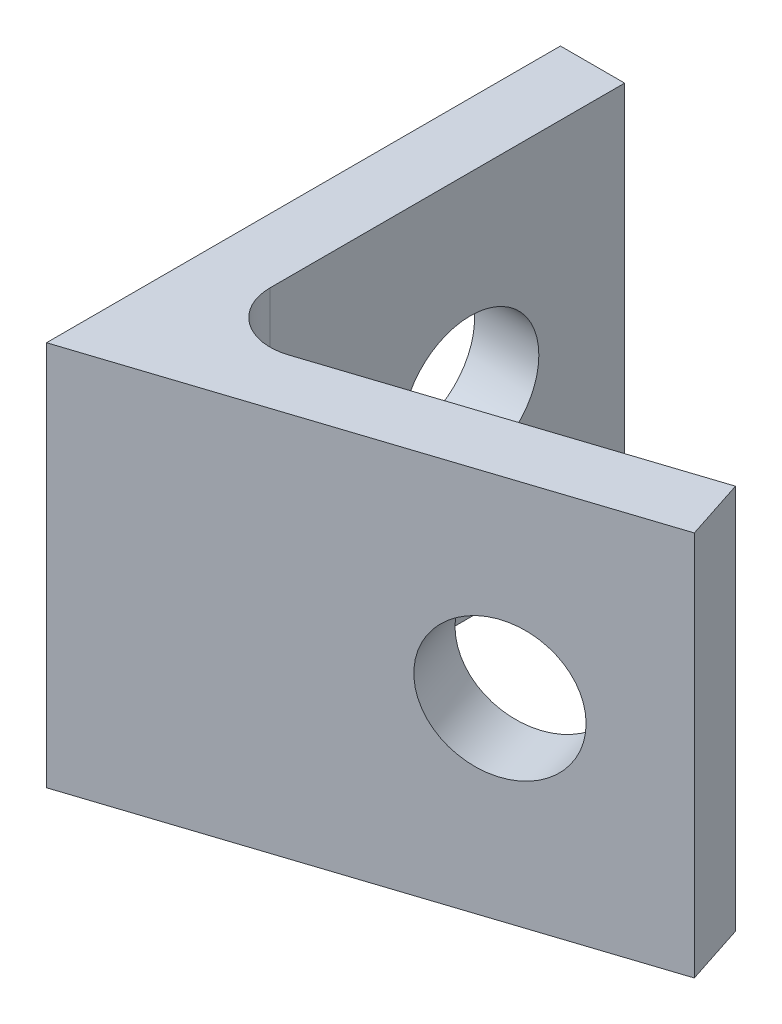
ISO-10303-21;
HEADER;
FILE_DESCRIPTION(('STEP AP214'),'2;1');
FILE_NAME('part.step','',(''),(''),'','','');
FILE_SCHEMA(('AUTOMOTIVE_DESIGN { 1 0 10303 214 1 1 1 1 }'));
ENDSEC;
DATA;
#1=APPLICATION_CONTEXT('core data for automotive mechanical design processes');
#2=APPLICATION_PROTOCOL_DEFINITION('international standard','automotive_design',2000,#1);
#3=PRODUCT_CONTEXT('',#1,'mechanical');
#4=PRODUCT('Part','Part','',(#3));
#5=PRODUCT_RELATED_PRODUCT_CATEGORY('part','',(#4));
#6=PRODUCT_DEFINITION_FORMATION('','',#4);
#7=PRODUCT_DEFINITION_CONTEXT('part definition',#1,'design');
#8=PRODUCT_DEFINITION('design','',#6,#7);
#9=PRODUCT_DEFINITION_SHAPE('','',#8);
#10=(LENGTH_UNIT() NAMED_UNIT(*) SI_UNIT(.MILLI.,.METRE.));
#11=(NAMED_UNIT(*) PLANE_ANGLE_UNIT() SI_UNIT($,.RADIAN.));
#12=(NAMED_UNIT(*) SI_UNIT($,.STERADIAN.) SOLID_ANGLE_UNIT());
#13=UNCERTAINTY_MEASURE_WITH_UNIT(LENGTH_MEASURE(1.E-05),#10,'distance_accuracy_value','');
#14=(GEOMETRIC_REPRESENTATION_CONTEXT(3) GLOBAL_UNCERTAINTY_ASSIGNED_CONTEXT((#13)) GLOBAL_UNIT_ASSIGNED_CONTEXT((#10,
#11,#12)) REPRESENTATION_CONTEXT('',''));
#15=CARTESIAN_POINT('',(0.,0.,0.));
#16=DIRECTION('',(0.,0.,1.));
#17=DIRECTION('',(1.,0.,0.));
#18=AXIS2_PLACEMENT_3D('',#15,#16,#17);
#19=CARTESIAN_POINT('',(3.175,19.05,-25.4));
#20=DIRECTION('',(1.,0.,0.));
#21=DIRECTION('',(0.,0.,-1.));
#22=AXIS2_PLACEMENT_3D('',#19,#20,#21);
#23=PLANE('',#22);
#24=CARTESIAN_POINT('',(3.175,9.525,-17.78));
#25=DIRECTION('',(1.,0.,0.));
#26=DIRECTION('',(0.,0.,-1.));
#27=AXIS2_PLACEMENT_3D('',#24,#25,#26);
#28=CIRCLE('',#27,3.3782);
#29=CARTESIAN_POINT('',(3.175,9.525,-21.1582));
#30=VERTEX_POINT('',#29);
#31=EDGE_CURVE('E143',#30,#30,#28,.T.);
#32=ORIENTED_EDGE('',*,*,#31,.F.);
#33=EDGE_LOOP('',(#32));
#34=FACE_BOUND('',#33,.T.);
#35=DIRECTION('',(0.,0.,1.));
#36=VECTOR('',#35,1.);
#37=CARTESIAN_POINT('',(3.175,19.05,-25.4));
#38=LINE('',#37,#36);
#39=CARTESIAN_POINT('',(3.175,19.05,-25.4));
#40=VERTEX_POINT('',#39);
#41=CARTESIAN_POINT('',(3.175,19.05,-7.87201998770114));
#42=VERTEX_POINT('',#41);
#43=EDGE_CURVE('E109',#40,#42,#38,.T.);
#44=ORIENTED_EDGE('',*,*,#43,.T.);
#45=DIRECTION('',(0.,-1.,0.));
#46=VECTOR('',#45,1.);
#47=CARTESIAN_POINT('',(3.175,0.,-7.87201998770114));
#48=LINE('',#47,#46);
#49=CARTESIAN_POINT('',(3.175,0.,-7.87201998770114));
#50=VERTEX_POINT('',#49);
#51=EDGE_CURVE('E163',#42,#50,#48,.T.);
#52=ORIENTED_EDGE('',*,*,#51,.T.);
#53=DIRECTION('',(0.,0.,1.));
#54=VECTOR('',#53,1.);
#55=CARTESIAN_POINT('',(3.175,0.,-25.4));
#56=LINE('',#55,#54);
#57=CARTESIAN_POINT('',(3.175,0.,-25.4));
#58=VERTEX_POINT('',#57);
#59=EDGE_CURVE('E139',#58,#50,#56,.T.);
#60=ORIENTED_EDGE('',*,*,#59,.F.);
#61=DIRECTION('',(0.,-1.,0.));
#62=VECTOR('',#61,1.);
#63=CARTESIAN_POINT('',(3.175,19.05,-25.4));
#64=LINE('',#63,#62);
#65=EDGE_CURVE('E160',#40,#58,#64,.T.);
#66=ORIENTED_EDGE('',*,*,#65,.F.);
#67=EDGE_LOOP('',(#44,#52,#60,#66));
#68=FACE_BOUND('',#67,.T.);
#69=ADVANCED_FACE('F43',(#34,#68),#23,.T.);
#70=CARTESIAN_POINT('',(0.,19.05,-25.4));
#71=DIRECTION('',(0.,0.,-1.));
#72=DIRECTION('',(-1.,0.,0.));
#73=AXIS2_PLACEMENT_3D('',#70,#71,#72);
#74=PLANE('',#73);
#75=DIRECTION('',(1.,0.,0.));
#76=VECTOR('',#75,1.);
#77=CARTESIAN_POINT('',(0.,0.,-25.4));
#78=LINE('',#77,#76);
#79=CARTESIAN_POINT('',(0.,0.,-25.4));
#80=VERTEX_POINT('',#79);
#81=EDGE_CURVE('E156',#80,#58,#78,.T.);
#82=ORIENTED_EDGE('',*,*,#81,.F.);
#83=DIRECTION('',(0.,-1.,0.));
#84=VECTOR('',#83,1.);
#85=CARTESIAN_POINT('',(0.,19.05,-25.4));
#86=LINE('',#85,#84);
#87=CARTESIAN_POINT('',(0.,19.05,-25.4));
#88=VERTEX_POINT('',#87);
#89=EDGE_CURVE('E164',#88,#80,#86,.T.);
#90=ORIENTED_EDGE('',*,*,#89,.F.);
#91=DIRECTION('',(1.,0.,0.));
#92=VECTOR('',#91,1.);
#93=CARTESIAN_POINT('',(0.,19.05,-25.4));
#94=LINE('',#93,#92);
#95=EDGE_CURVE('E118',#88,#40,#94,.T.);
#96=ORIENTED_EDGE('',*,*,#95,.T.);
#97=ORIENTED_EDGE('',*,*,#65,.T.);
#98=EDGE_LOOP('',(#82,#90,#96,#97));
#99=FACE_BOUND('',#98,.T.);
#100=ADVANCED_FACE('F186',(#99),#74,.T.);
#101=CARTESIAN_POINT('',(0.,19.05,0.));
#102=DIRECTION('',(-1.,0.,0.));
#103=DIRECTION('',(0.,0.,1.));
#104=AXIS2_PLACEMENT_3D('',#101,#102,#103);
#105=PLANE('',#104);
#106=CARTESIAN_POINT('',(0.,9.525,-17.78));
#107=DIRECTION('',(-1.,0.,0.));
#108=DIRECTION('',(0.,0.,1.));
#109=AXIS2_PLACEMENT_3D('',#106,#107,#108);
#110=CIRCLE('',#109,3.3782);
#111=CARTESIAN_POINT('',(0.,9.525,-14.4018));
#112=VERTEX_POINT('',#111);
#113=EDGE_CURVE('E193',#112,#112,#110,.T.);
#114=ORIENTED_EDGE('',*,*,#113,.F.);
#115=EDGE_LOOP('',(#114));
#116=FACE_BOUND('',#115,.T.);
#117=DIRECTION('',(0.,0.,-1.));
#118=VECTOR('',#117,1.);
#119=CARTESIAN_POINT('',(0.,0.,0.));
#120=LINE('',#119,#118);
#121=CARTESIAN_POINT('',(0.,0.,0.));
#122=VERTEX_POINT('',#121);
#123=EDGE_CURVE('E152',#122,#80,#120,.T.);
#124=ORIENTED_EDGE('',*,*,#123,.F.);
#125=DIRECTION('',(0.,-1.,0.));
#126=VECTOR('',#125,1.);
#127=CARTESIAN_POINT('',(0.,19.05,0.));
#128=LINE('',#127,#126);
#129=CARTESIAN_POINT('',(0.,19.05,0.));
#130=VERTEX_POINT('',#129);
#131=EDGE_CURVE('E167',#130,#122,#128,.T.);
#132=ORIENTED_EDGE('',*,*,#131,.F.);
#133=DIRECTION('',(0.,0.,-1.));
#134=VECTOR('',#133,1.);
#135=CARTESIAN_POINT('',(0.,19.05,0.));
#136=LINE('',#135,#134);
#137=EDGE_CURVE('E129',#130,#88,#136,.T.);
#138=ORIENTED_EDGE('',*,*,#137,.T.);
#139=ORIENTED_EDGE('',*,*,#89,.T.);
#140=EDGE_LOOP('',(#124,#132,#138,#139));
#141=FACE_BOUND('',#140,.T.);
#142=ADVANCED_FACE('F212',(#116,#141),#105,.T.);
#143=CARTESIAN_POINT('',(24.1511405465603,19.05,-7.86653737678082));
#144=DIRECTION('',(0.309706195936253,0.,0.95083230498269));
#145=DIRECTION('',(0.95083230498269,0.,-0.309706195936253));
#146=AXIS2_PLACEMENT_3D('',#143,#144,#145);
#147=PLANE('',#146);
#148=CARTESIAN_POINT('',(16.9057983825922,9.525,-5.50657616374657));
#149=DIRECTION('',(0.309706195936253,0.,0.95083230498269));
#150=DIRECTION('',(0.95083230498269,0.,-0.309706195936253));
#151=AXIS2_PLACEMENT_3D('',#148,#149,#150);
#152=CIRCLE('',#151,3.37819999999999);
#153=CARTESIAN_POINT('',(20.1179000752847,9.525,-6.55282563485841));
#154=VERTEX_POINT('',#153);
#155=EDGE_CURVE('E201',#154,#154,#152,.T.);
#156=ORIENTED_EDGE('',*,*,#155,.F.);
#157=EDGE_LOOP('',(#156));
#158=FACE_BOUND('',#157,.T.);
#159=DIRECTION('',(-0.95083230498269,0.,0.309706195936253));
#160=VECTOR('',#159,1.);
#161=CARTESIAN_POINT('',(24.1511405465603,0.,-7.86653737678082));
#162=LINE('',#161,#160);
#163=CARTESIAN_POINT('',(24.1511405465603,0.,-7.86653737678082));
#164=VERTEX_POINT('',#163);
#165=EDGE_CURVE('E148',#164,#122,#162,.T.);
#166=ORIENTED_EDGE('',*,*,#165,.F.);
#167=DIRECTION('',(0.,-1.,0.));
#168=VECTOR('',#167,1.);
#169=CARTESIAN_POINT('',(24.1511405465603,19.05,-7.86653737678082));
#170=LINE('',#169,#168);
#171=CARTESIAN_POINT('',(24.1511405465603,19.05,-7.86653737678082));
#172=VERTEX_POINT('',#171);
#173=EDGE_CURVE('E117',#172,#164,#170,.T.);
#174=ORIENTED_EDGE('',*,*,#173,.F.);
#175=DIRECTION('',(-0.95083230498269,0.,0.309706195936253));
#176=VECTOR('',#175,1.);
#177=CARTESIAN_POINT('',(24.1511405465603,19.05,-7.86653737678082));
#178=LINE('',#177,#176);
#179=EDGE_CURVE('E125',#172,#130,#178,.T.);
#180=ORIENTED_EDGE('',*,*,#179,.T.);
#181=ORIENTED_EDGE('',*,*,#131,.T.);
#182=EDGE_LOOP('',(#166,#174,#180,#181));
#183=FACE_BOUND('',#182,.T.);
#184=ADVANCED_FACE('F209',(#158,#183),#147,.T.);
#185=CARTESIAN_POINT('',(23.1678233744627,19.05,-10.8854299451009));
#186=DIRECTION('',(0.95083230498269,0.,-0.309706195936253));
#187=DIRECTION('',(-0.309706195936253,0.,-0.95083230498269));
#188=AXIS2_PLACEMENT_3D('',#185,#186,#187);
#189=PLANE('',#188);
#190=DIRECTION('',(0.309706195936253,0.,0.95083230498269));
#191=VECTOR('',#190,1.);
#192=CARTESIAN_POINT('',(23.1678233744627,0.,-10.8854299451009));
#193=LINE('',#192,#191);
#194=CARTESIAN_POINT('',(23.1678233744627,0.,-10.8854299451009));
#195=VERTEX_POINT('',#194);
#196=EDGE_CURVE('E115',#195,#164,#193,.T.);
#197=ORIENTED_EDGE('',*,*,#196,.F.);
#198=DIRECTION('',(0.,-1.,0.));
#199=VECTOR('',#198,1.);
#200=CARTESIAN_POINT('',(23.1678233744627,19.05,-10.8854299451009));
#201=LINE('',#200,#199);
#202=CARTESIAN_POINT('',(23.1678233744627,19.05,-10.8854299451009));
#203=VERTEX_POINT('',#202);
#204=EDGE_CURVE('E102',#203,#195,#201,.T.);
#205=ORIENTED_EDGE('',*,*,#204,.F.);
#206=DIRECTION('',(0.309706195936253,0.,0.95083230498269));
#207=VECTOR('',#206,1.);
#208=CARTESIAN_POINT('',(23.1678233744627,19.05,-10.8854299451009));
#209=LINE('',#208,#207);
#210=EDGE_CURVE('E108',#203,#172,#209,.T.);
#211=ORIENTED_EDGE('',*,*,#210,.T.);
#212=ORIENTED_EDGE('',*,*,#173,.T.);
#213=EDGE_LOOP('',(#197,#205,#211,#212));
#214=FACE_BOUND('',#213,.T.);
#215=ADVANCED_FACE('F113',(#214),#189,.T.);
#216=CARTESIAN_POINT('',(3.175,19.05,-4.37334443761175));
#217=DIRECTION('',(-0.309706195936253,0.,-0.95083230498269));
#218=DIRECTION('',(-0.95083230498269,0.,0.309706195936253));
#219=AXIS2_PLACEMENT_3D('',#216,#217,#218);
#220=PLANE('',#219);
#221=CARTESIAN_POINT('',(15.9224812104946,9.525,-8.52546873206661));
#222=DIRECTION('',(-0.309706195936253,0.,-0.95083230498269));
#223=DIRECTION('',(-0.95083230498269,0.,0.309706195936253));
#224=AXIS2_PLACEMENT_3D('',#221,#222,#223);
#225=CIRCLE('',#224,3.37819999999999);
#226=CARTESIAN_POINT('',(12.7103795178021,9.525,-7.47921926095477));
#227=VERTEX_POINT('',#226);
#228=EDGE_CURVE('E197',#227,#227,#225,.T.);
#229=ORIENTED_EDGE('',*,*,#228,.F.);
#230=EDGE_LOOP('',(#229));
#231=FACE_BOUND('',#230,.T.);
#232=DIRECTION('',(0.95083230498269,0.,-0.309706195936253));
#233=VECTOR('',#232,1.);
#234=CARTESIAN_POINT('',(3.175,0.,-4.37334443761175));
#235=LINE('',#234,#233);
#236=CARTESIAN_POINT('',(6.50165373767808,0.,-5.45690593304511));
#237=VERTEX_POINT('',#236);
#238=EDGE_CURVE('E142',#237,#195,#235,.T.);
#239=ORIENTED_EDGE('',*,*,#238,.F.);
#240=DIRECTION('',(0.,-1.,0.));
#241=VECTOR('',#240,1.);
#242=CARTESIAN_POINT('',(6.50165373767808,19.05,-5.45690593304511));
#243=LINE('',#242,#241);
#244=CARTESIAN_POINT('',(6.50165373767808,19.05,-5.45690593304511));
#245=VERTEX_POINT('',#244);
#246=EDGE_CURVE('E59',#237,#245,#243,.F.);
#247=ORIENTED_EDGE('',*,*,#246,.T.);
#248=DIRECTION('',(0.95083230498269,0.,-0.309706195936253));
#249=VECTOR('',#248,1.);
#250=CARTESIAN_POINT('',(3.175,19.05,-4.37334443761175));
#251=LINE('',#250,#249);
#252=EDGE_CURVE('E99',#245,#203,#251,.T.);
#253=ORIENTED_EDGE('',*,*,#252,.T.);
#254=ORIENTED_EDGE('',*,*,#204,.T.);
#255=EDGE_LOOP('',(#239,#247,#253,#254));
#256=FACE_BOUND('',#255,.T.);
#257=ADVANCED_FACE('F101',(#231,#256),#220,.T.);
#258=CARTESIAN_POINT('',(0.,19.05,0.));
#259=DIRECTION('',(0.,1.,0.));
#260=DIRECTION('',(0.,0.,1.));
#261=AXIS2_PLACEMENT_3D('',#258,#259,#260);
#262=PLANE('',#261);
#263=ORIENTED_EDGE('',*,*,#43,.F.);
#264=ORIENTED_EDGE('',*,*,#95,.F.);
#265=ORIENTED_EDGE('',*,*,#137,.F.);
#266=ORIENTED_EDGE('',*,*,#179,.F.);
#267=ORIENTED_EDGE('',*,*,#210,.F.);
#268=ORIENTED_EDGE('',*,*,#252,.F.);
#269=CARTESIAN_POINT('',(5.715,19.05,-7.87201998770114));
#270=DIRECTION('',(0.,1.,0.));
#271=DIRECTION('',(0.,0.,1.));
#272=AXIS2_PLACEMENT_3D('',#269,#270,#271);
#273=CIRCLE('',#272,2.54);
#274=EDGE_CURVE('E11',#245,#42,#273,.F.);
#275=ORIENTED_EDGE('',*,*,#274,.T.);
#276=EDGE_LOOP('',(#263,#264,#265,#266,#267,#268,#275));
#277=FACE_BOUND('',#276,.T.);
#278=ADVANCED_FACE('F122',(#277),#262,.T.);
#279=CARTESIAN_POINT('',(0.,0.,0.));
#280=DIRECTION('',(0.,1.,0.));
#281=DIRECTION('',(0.,0.,1.));
#282=AXIS2_PLACEMENT_3D('',#279,#280,#281);
#283=PLANE('',#282);
#284=ORIENTED_EDGE('',*,*,#59,.T.);
#285=CARTESIAN_POINT('',(5.715,0.,-7.87201998770114));
#286=DIRECTION('',(0.,1.,0.));
#287=DIRECTION('',(0.,0.,1.));
#288=AXIS2_PLACEMENT_3D('',#285,#286,#287);
#289=CIRCLE('',#288,2.54);
#290=EDGE_CURVE('E52',#50,#237,#289,.T.);
#291=ORIENTED_EDGE('',*,*,#290,.T.);
#292=ORIENTED_EDGE('',*,*,#238,.T.);
#293=ORIENTED_EDGE('',*,*,#196,.T.);
#294=ORIENTED_EDGE('',*,*,#165,.T.);
#295=ORIENTED_EDGE('',*,*,#123,.T.);
#296=ORIENTED_EDGE('',*,*,#81,.T.);
#297=EDGE_LOOP('',(#284,#291,#292,#293,#294,#295,#296));
#298=FACE_BOUND('',#297,.T.);
#299=ADVANCED_FACE('F182',(#298),#283,.F.);
#300=CARTESIAN_POINT('',(5.715,19.05,-7.87201998770114));
#301=DIRECTION('',(0.,1.,0.));
#302=DIRECTION('',(0.,0.,1.));
#303=AXIS2_PLACEMENT_3D('',#300,#301,#302);
#304=CYLINDRICAL_SURFACE('',#303,2.54);
#305=ORIENTED_EDGE('',*,*,#274,.F.);
#306=ORIENTED_EDGE('',*,*,#246,.F.);
#307=ORIENTED_EDGE('',*,*,#290,.F.);
#308=ORIENTED_EDGE('',*,*,#51,.F.);
#309=EDGE_LOOP('',(#305,#306,#307,#308));
#310=FACE_BOUND('',#309,.T.);
#311=ADVANCED_FACE('F45',(#310),#304,.F.);
#312=CARTESIAN_POINT('',(0.,9.525,-17.78));
#313=DIRECTION('',(-1.,0.,0.));
#314=DIRECTION('',(0.,0.,1.));
#315=AXIS2_PLACEMENT_3D('',#312,#313,#314);
#316=CYLINDRICAL_SURFACE('',#315,3.3782);
#317=ORIENTED_EDGE('',*,*,#113,.T.);
#318=EDGE_LOOP('',(#317));
#319=FACE_BOUND('',#318,.T.);
#320=ORIENTED_EDGE('',*,*,#31,.T.);
#321=EDGE_LOOP('',(#320));
#322=FACE_BOUND('',#321,.T.);
#323=ADVANCED_FACE('F216',(#319,#322),#316,.F.);
#324=CARTESIAN_POINT('',(16.9057983825922,9.525,-5.50657616374657));
#325=DIRECTION('',(0.309706195936253,0.,0.95083230498269));
#326=DIRECTION('',(0.95083230498269,0.,-0.309706195936253));
#327=AXIS2_PLACEMENT_3D('',#324,#325,#326);
#328=CYLINDRICAL_SURFACE('',#327,3.37819999999999);
#329=ORIENTED_EDGE('',*,*,#155,.T.);
#330=EDGE_LOOP('',(#329));
#331=FACE_BOUND('',#330,.T.);
#332=ORIENTED_EDGE('',*,*,#228,.T.);
#333=EDGE_LOOP('',(#332));
#334=FACE_BOUND('',#333,.T.);
#335=ADVANCED_FACE('F206',(#331,#334),#328,.F.);
#336=CLOSED_SHELL('',(#69,#100,#142,#184,#215,#257,#278,#299,#311,#323,#335));
#337=MANIFOLD_SOLID_BREP('B2',#336);
#338=ADVANCED_BREP_SHAPE_REPRESENTATION('',(#18,#337),#14);
#339=SHAPE_DEFINITION_REPRESENTATION(#9,#338);
ENDSEC;
END-ISO-10303-21;
